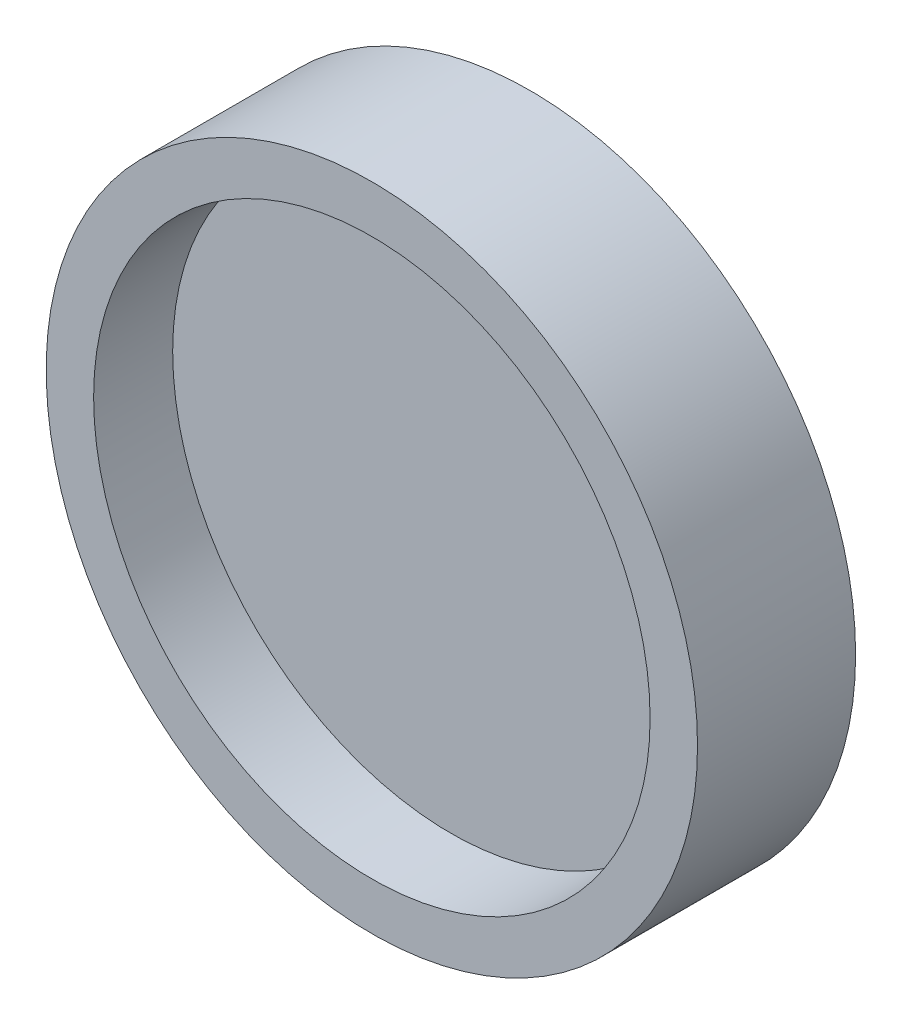
ISO-10303-21;
HEADER;
FILE_DESCRIPTION(('STEP AP214'),'2;1');
FILE_NAME('part.step','',(''),(''),'','','');
FILE_SCHEMA(('AUTOMOTIVE_DESIGN { 1 0 10303 214 1 1 1 1 }'));
ENDSEC;
DATA;
#1=APPLICATION_CONTEXT('core data for automotive mechanical design processes');
#2=APPLICATION_PROTOCOL_DEFINITION('international standard','automotive_design',2000,#1);
#3=PRODUCT_CONTEXT('',#1,'mechanical');
#4=PRODUCT('Part','Part','',(#3));
#5=PRODUCT_RELATED_PRODUCT_CATEGORY('part','',(#4));
#6=PRODUCT_DEFINITION_FORMATION('','',#4);
#7=PRODUCT_DEFINITION_CONTEXT('part definition',#1,'design');
#8=PRODUCT_DEFINITION('design','',#6,#7);
#9=PRODUCT_DEFINITION_SHAPE('','',#8);
#10=(LENGTH_UNIT() NAMED_UNIT(*) SI_UNIT(.MILLI.,.METRE.));
#11=(NAMED_UNIT(*) PLANE_ANGLE_UNIT() SI_UNIT($,.RADIAN.));
#12=(NAMED_UNIT(*) SI_UNIT($,.STERADIAN.) SOLID_ANGLE_UNIT());
#13=UNCERTAINTY_MEASURE_WITH_UNIT(LENGTH_MEASURE(1.E-05),#10,'distance_accuracy_value','');
#14=(GEOMETRIC_REPRESENTATION_CONTEXT(3) GLOBAL_UNCERTAINTY_ASSIGNED_CONTEXT((#13)) GLOBAL_UNIT_ASSIGNED_CONTEXT((#10,
#11,#12)) REPRESENTATION_CONTEXT('',''));
#15=CARTESIAN_POINT('',(0.,0.,0.));
#16=DIRECTION('',(0.,0.,1.));
#17=DIRECTION('',(1.,0.,0.));
#18=AXIS2_PLACEMENT_3D('',#15,#16,#17);
#19=CARTESIAN_POINT('',(0.,0.,20.));
#20=DIRECTION('',(0.,0.,-1.));
#21=DIRECTION('',(-1.,0.,0.));
#22=AXIS2_PLACEMENT_3D('',#19,#20,#21);
#23=CYLINDRICAL_SURFACE('',#22,41.2);
#24=CARTESIAN_POINT('',(0.,0.,20.));
#25=DIRECTION('',(0.,0.,1.));
#26=DIRECTION('',(1.,0.,0.));
#27=AXIS2_PLACEMENT_3D('',#24,#25,#26);
#28=CIRCLE('',#27,41.2);
#29=CARTESIAN_POINT('',(41.2,0.,20.));
#30=VERTEX_POINT('',#29);
#31=EDGE_CURVE('E10',#30,#30,#28,.T.);
#32=ORIENTED_EDGE('',*,*,#31,.F.);
#33=EDGE_LOOP('',(#32));
#34=FACE_BOUND('',#33,.T.);
#35=CARTESIAN_POINT('',(0.,0.,0.));
#36=DIRECTION('',(0.,0.,1.));
#37=DIRECTION('',(1.,0.,0.));
#38=AXIS2_PLACEMENT_3D('',#35,#36,#37);
#39=CIRCLE('',#38,41.2);
#40=CARTESIAN_POINT('',(41.2,0.,0.));
#41=VERTEX_POINT('',#40);
#42=EDGE_CURVE('E34',#41,#41,#39,.T.);
#43=ORIENTED_EDGE('',*,*,#42,.T.);
#44=EDGE_LOOP('',(#43));
#45=FACE_BOUND('',#44,.T.);
#46=ADVANCED_FACE('F31',(#34,#45),#23,.T.);
#47=CARTESIAN_POINT('',(0.,0.,20.));
#48=DIRECTION('',(0.,0.,1.));
#49=DIRECTION('',(1.,0.,0.));
#50=AXIS2_PLACEMENT_3D('',#47,#48,#49);
#51=PLANE('',#50);
#52=CARTESIAN_POINT('',(0.,0.,20.));
#53=DIRECTION('',(0.,0.,1.));
#54=DIRECTION('',(1.,0.,0.));
#55=AXIS2_PLACEMENT_3D('',#52,#53,#54);
#56=CIRCLE('',#55,35.2);
#57=CARTESIAN_POINT('',(35.2,0.,20.));
#58=VERTEX_POINT('',#57);
#59=EDGE_CURVE('E43',#58,#58,#56,.T.);
#60=ORIENTED_EDGE('',*,*,#59,.F.);
#61=EDGE_LOOP('',(#60));
#62=FACE_BOUND('',#61,.T.);
#63=ORIENTED_EDGE('',*,*,#31,.T.);
#64=EDGE_LOOP('',(#63));
#65=FACE_BOUND('',#64,.T.);
#66=ADVANCED_FACE('F58',(#62,#65),#51,.T.);
#67=CARTESIAN_POINT('',(0.,0.,0.));
#68=DIRECTION('',(0.,0.,1.));
#69=DIRECTION('',(1.,0.,0.));
#70=AXIS2_PLACEMENT_3D('',#67,#68,#69);
#71=PLANE('',#70);
#72=ORIENTED_EDGE('',*,*,#42,.F.);
#73=EDGE_LOOP('',(#72));
#74=FACE_BOUND('',#73,.T.);
#75=ADVANCED_FACE('F54',(#74),#71,.F.);
#76=CARTESIAN_POINT('',(0.,0.,10.));
#77=DIRECTION('',(0.,0.,1.));
#78=DIRECTION('',(1.,0.,0.));
#79=AXIS2_PLACEMENT_3D('',#76,#77,#78);
#80=CYLINDRICAL_SURFACE('',#79,35.2);
#81=CARTESIAN_POINT('',(0.,0.,10.));
#82=DIRECTION('',(0.,0.,1.));
#83=DIRECTION('',(1.,0.,0.));
#84=AXIS2_PLACEMENT_3D('',#81,#82,#83);
#85=CIRCLE('',#84,35.2);
#86=CARTESIAN_POINT('',(35.2,0.,10.));
#87=VERTEX_POINT('',#86);
#88=EDGE_CURVE('E41',#87,#87,#85,.T.);
#89=ORIENTED_EDGE('',*,*,#88,.F.);
#90=EDGE_LOOP('',(#89));
#91=FACE_BOUND('',#90,.T.);
#92=ORIENTED_EDGE('',*,*,#59,.T.);
#93=EDGE_LOOP('',(#92));
#94=FACE_BOUND('',#93,.T.);
#95=ADVANCED_FACE('F51',(#91,#94),#80,.F.);
#96=CARTESIAN_POINT('',(0.,0.,10.));
#97=DIRECTION('',(0.,0.,1.));
#98=DIRECTION('',(1.,0.,0.));
#99=AXIS2_PLACEMENT_3D('',#96,#97,#98);
#100=PLANE('',#99);
#101=ORIENTED_EDGE('',*,*,#88,.T.);
#102=EDGE_LOOP('',(#101));
#103=FACE_BOUND('',#102,.T.);
#104=ADVANCED_FACE('F49',(#103),#100,.T.);
#105=CLOSED_SHELL('',(#46,#66,#75,#95,#104));
#106=MANIFOLD_SOLID_BREP('B2',#105);
#107=ADVANCED_BREP_SHAPE_REPRESENTATION('',(#18,#106),#14);
#108=SHAPE_DEFINITION_REPRESENTATION(#9,#107);
ENDSEC;
END-ISO-10303-21;
